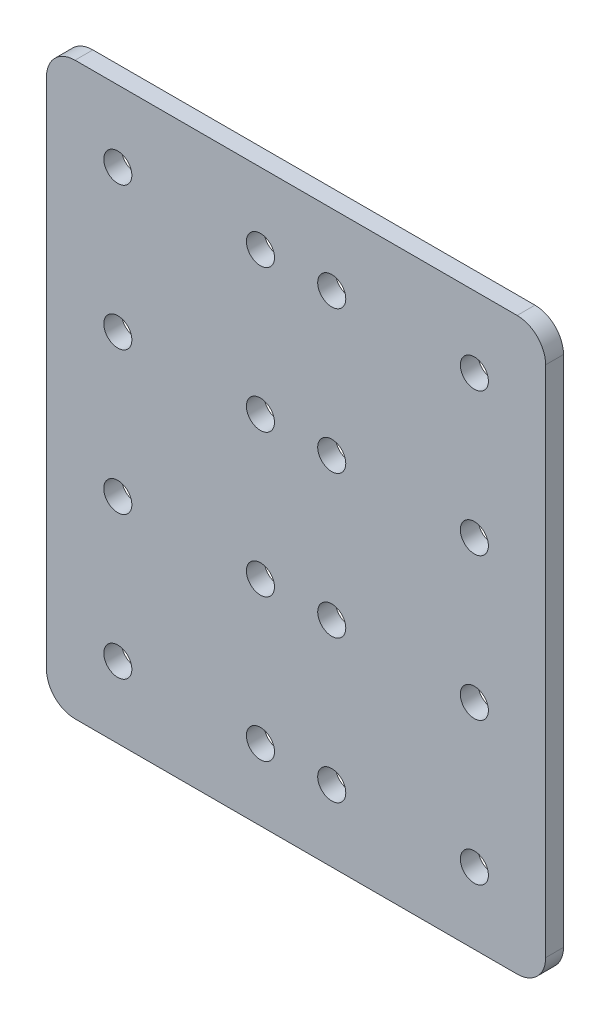
ISO-10303-21;
HEADER;
FILE_DESCRIPTION(('STEP AP214'),'2;1');
FILE_NAME('part.step','',(''),(''),'','','');
FILE_SCHEMA(('AUTOMOTIVE_DESIGN { 1 0 10303 214 1 1 1 1 }'));
ENDSEC;
DATA;
#1=APPLICATION_CONTEXT('core data for automotive mechanical design processes');
#2=APPLICATION_PROTOCOL_DEFINITION('international standard','automotive_design',2000,#1);
#3=PRODUCT_CONTEXT('',#1,'mechanical');
#4=PRODUCT('Part','Part','',(#3));
#5=PRODUCT_RELATED_PRODUCT_CATEGORY('part','',(#4));
#6=PRODUCT_DEFINITION_FORMATION('','',#4);
#7=PRODUCT_DEFINITION_CONTEXT('part definition',#1,'design');
#8=PRODUCT_DEFINITION('design','',#6,#7);
#9=PRODUCT_DEFINITION_SHAPE('','',#8);
#10=(LENGTH_UNIT() NAMED_UNIT(*) SI_UNIT(.MILLI.,.METRE.));
#11=(NAMED_UNIT(*) PLANE_ANGLE_UNIT() SI_UNIT($,.RADIAN.));
#12=(NAMED_UNIT(*) SI_UNIT($,.STERADIAN.) SOLID_ANGLE_UNIT());
#13=UNCERTAINTY_MEASURE_WITH_UNIT(LENGTH_MEASURE(1.E-05),#10,'distance_accuracy_value','');
#14=(GEOMETRIC_REPRESENTATION_CONTEXT(3) GLOBAL_UNCERTAINTY_ASSIGNED_CONTEXT((#13)) GLOBAL_UNIT_ASSIGNED_CONTEXT((#10,
#11,#12)) REPRESENTATION_CONTEXT('',''));
#15=CARTESIAN_POINT('',(0.,0.,0.));
#16=DIRECTION('',(0.,0.,1.));
#17=DIRECTION('',(1.,0.,0.));
#18=AXIS2_PLACEMENT_3D('',#15,#16,#17);
#19=CARTESIAN_POINT('',(1176.02,20.32,3.175));
#20=DIRECTION('',(0.,0.,-1.));
#21=DIRECTION('',(-1.,0.,0.));
#22=AXIS2_PLACEMENT_3D('',#19,#20,#21);
#23=PLANE('',#22);
#24=CARTESIAN_POINT('',(1176.02,20.32,3.175));
#25=DIRECTION('',(0.,0.,1.));
#26=DIRECTION('',(-1.,0.,0.));
#27=AXIS2_PLACEMENT_3D('',#24,#25,#26);
#28=CIRCLE('',#27,5.07999999999999);
#29=CARTESIAN_POINT('',(1181.1,20.32,3.175));
#30=VERTEX_POINT('',#29);
#31=CARTESIAN_POINT('',(1176.02,25.4,3.175));
#32=VERTEX_POINT('',#31);
#33=EDGE_CURVE('E145',#30,#32,#28,.T.);
#34=ORIENTED_EDGE('',*,*,#33,.T.);
#35=DIRECTION('',(-1.,0.,0.));
#36=VECTOR('',#35,1.);
#37=CARTESIAN_POINT('',(1176.02,25.4,3.175));
#38=LINE('',#37,#36);
#39=CARTESIAN_POINT('',(1097.28,25.4,3.175));
#40=VERTEX_POINT('',#39);
#41=EDGE_CURVE('E93',#32,#40,#38,.T.);
#42=ORIENTED_EDGE('',*,*,#41,.T.);
#43=CARTESIAN_POINT('',(1097.28,20.32,3.175));
#44=DIRECTION('',(0.,0.,1.));
#45=DIRECTION('',(1.,0.,0.));
#46=AXIS2_PLACEMENT_3D('',#43,#44,#45);
#47=CIRCLE('',#46,5.07999999999999);
#48=CARTESIAN_POINT('',(1092.2,20.32,3.175));
#49=VERTEX_POINT('',#48);
#50=EDGE_CURVE('E160',#40,#49,#47,.T.);
#51=ORIENTED_EDGE('',*,*,#50,.T.);
#52=DIRECTION('',(0.,-1.,0.));
#53=VECTOR('',#52,1.);
#54=CARTESIAN_POINT('',(1092.2,20.32,3.175));
#55=LINE('',#54,#53);
#56=CARTESIAN_POINT('',(1092.2,-71.1199999999999,3.175));
#57=VERTEX_POINT('',#56);
#58=EDGE_CURVE('E173',#49,#57,#55,.T.);
#59=ORIENTED_EDGE('',*,*,#58,.T.);
#60=CARTESIAN_POINT('',(1097.28,-71.1199999999999,3.175));
#61=DIRECTION('',(0.,0.,1.));
#62=DIRECTION('',(-1.,0.,0.));
#63=AXIS2_PLACEMENT_3D('',#60,#61,#62);
#64=CIRCLE('',#63,5.07999999999998);
#65=CARTESIAN_POINT('',(1097.28,-76.1999999999999,3.175));
#66=VERTEX_POINT('',#65);
#67=EDGE_CURVE('E112',#57,#66,#64,.T.);
#68=ORIENTED_EDGE('',*,*,#67,.T.);
#69=DIRECTION('',(1.,0.,0.));
#70=VECTOR('',#69,1.);
#71=CARTESIAN_POINT('',(1176.02,-76.2,3.175));
#72=LINE('',#71,#70);
#73=CARTESIAN_POINT('',(1176.02,-76.2,3.175));
#74=VERTEX_POINT('',#73);
#75=EDGE_CURVE('E106',#66,#74,#72,.T.);
#76=ORIENTED_EDGE('',*,*,#75,.T.);
#77=CARTESIAN_POINT('',(1176.02,-71.12,3.175));
#78=DIRECTION('',(0.,0.,1.));
#79=DIRECTION('',(-1.,0.,0.));
#80=AXIS2_PLACEMENT_3D('',#77,#78,#79);
#81=CIRCLE('',#80,5.07999999999999);
#82=CARTESIAN_POINT('',(1181.1,-71.1199999999999,3.175));
#83=VERTEX_POINT('',#82);
#84=EDGE_CURVE('E110',#74,#83,#81,.T.);
#85=ORIENTED_EDGE('',*,*,#84,.T.);
#86=DIRECTION('',(0.,1.,0.));
#87=VECTOR('',#86,1.);
#88=CARTESIAN_POINT('',(1181.1,20.32,3.175));
#89=LINE('',#88,#87);
#90=EDGE_CURVE('E50',#83,#30,#89,.T.);
#91=ORIENTED_EDGE('',*,*,#90,.T.);
#92=EDGE_LOOP('',(#34,#42,#51,#59,#68,#76,#85,#91));
#93=FACE_BOUND('',#92,.T.);
#94=CARTESIAN_POINT('',(1143.,12.7,3.175));
#95=DIRECTION('',(0.,0.,1.));
#96=DIRECTION('',(1.,0.,0.));
#97=AXIS2_PLACEMENT_3D('',#94,#95,#96);
#98=CIRCLE('',#97,2.49999999999969);
#99=CARTESIAN_POINT('',(1145.5,12.7,3.175));
#100=VERTEX_POINT('',#99);
#101=EDGE_CURVE('E134',#100,#100,#98,.T.);
#102=ORIENTED_EDGE('',*,*,#101,.F.);
#103=EDGE_LOOP('',(#102));
#104=FACE_BOUND('',#103,.T.);
#105=CARTESIAN_POINT('',(1168.4,12.7000000000004,3.175));
#106=DIRECTION('',(0.,0.,1.));
#107=DIRECTION('',(1.,0.,0.));
#108=AXIS2_PLACEMENT_3D('',#105,#106,#107);
#109=CIRCLE('',#108,2.49999999999969);
#110=CARTESIAN_POINT('',(1170.9,12.7000000000004,3.175));
#111=VERTEX_POINT('',#110);
#112=EDGE_CURVE('E182',#111,#111,#109,.T.);
#113=ORIENTED_EDGE('',*,*,#112,.F.);
#114=EDGE_LOOP('',(#113));
#115=FACE_BOUND('',#114,.T.);
#116=CARTESIAN_POINT('',(1104.9,12.7000000000004,3.175));
#117=DIRECTION('',(0.,0.,1.));
#118=DIRECTION('',(-1.,0.,0.));
#119=AXIS2_PLACEMENT_3D('',#116,#117,#118);
#120=CIRCLE('',#119,2.49999999999969);
#121=CARTESIAN_POINT('',(1102.4,12.7000000000004,3.175));
#122=VERTEX_POINT('',#121);
#123=EDGE_CURVE('E188',#122,#122,#120,.T.);
#124=ORIENTED_EDGE('',*,*,#123,.F.);
#125=EDGE_LOOP('',(#124));
#126=FACE_BOUND('',#125,.T.);
#127=CARTESIAN_POINT('',(1168.4,-12.6999999999996,3.175));
#128=DIRECTION('',(0.,0.,1.));
#129=DIRECTION('',(1.,0.,0.));
#130=AXIS2_PLACEMENT_3D('',#127,#128,#129);
#131=CIRCLE('',#130,2.49999999999969);
#132=CARTESIAN_POINT('',(1170.9,-12.6999999999996,3.175));
#133=VERTEX_POINT('',#132);
#134=EDGE_CURVE('E194',#133,#133,#131,.T.);
#135=ORIENTED_EDGE('',*,*,#134,.F.);
#136=EDGE_LOOP('',(#135));
#137=FACE_BOUND('',#136,.T.);
#138=CARTESIAN_POINT('',(1104.9,-12.6999999999996,3.175));
#139=DIRECTION('',(0.,0.,1.));
#140=DIRECTION('',(-1.,0.,0.));
#141=AXIS2_PLACEMENT_3D('',#138,#139,#140);
#142=CIRCLE('',#141,2.49999999999969);
#143=CARTESIAN_POINT('',(1102.4,-12.6999999999996,3.175));
#144=VERTEX_POINT('',#143);
#145=EDGE_CURVE('E200',#144,#144,#142,.T.);
#146=ORIENTED_EDGE('',*,*,#145,.F.);
#147=EDGE_LOOP('',(#146));
#148=FACE_BOUND('',#147,.T.);
#149=CARTESIAN_POINT('',(1168.4,-38.0999999999996,3.175));
#150=DIRECTION('',(0.,0.,1.));
#151=DIRECTION('',(1.,0.,0.));
#152=AXIS2_PLACEMENT_3D('',#149,#150,#151);
#153=CIRCLE('',#152,2.49999999999969);
#154=CARTESIAN_POINT('',(1170.9,-38.0999999999996,3.175));
#155=VERTEX_POINT('',#154);
#156=EDGE_CURVE('E206',#155,#155,#153,.T.);
#157=ORIENTED_EDGE('',*,*,#156,.F.);
#158=EDGE_LOOP('',(#157));
#159=FACE_BOUND('',#158,.T.);
#160=CARTESIAN_POINT('',(1104.9,-38.0999999999996,3.175));
#161=DIRECTION('',(0.,0.,1.));
#162=DIRECTION('',(-1.,0.,0.));
#163=AXIS2_PLACEMENT_3D('',#160,#161,#162);
#164=CIRCLE('',#163,2.49999999999969);
#165=CARTESIAN_POINT('',(1102.4,-38.0999999999996,3.175));
#166=VERTEX_POINT('',#165);
#167=EDGE_CURVE('E212',#166,#166,#164,.T.);
#168=ORIENTED_EDGE('',*,*,#167,.F.);
#169=EDGE_LOOP('',(#168));
#170=FACE_BOUND('',#169,.T.);
#171=CARTESIAN_POINT('',(1168.4,-63.4999999999996,3.175));
#172=DIRECTION('',(0.,0.,1.));
#173=DIRECTION('',(1.,0.,0.));
#174=AXIS2_PLACEMENT_3D('',#171,#172,#173);
#175=CIRCLE('',#174,2.49999999999968);
#176=CARTESIAN_POINT('',(1170.9,-63.4999999999996,3.175));
#177=VERTEX_POINT('',#176);
#178=EDGE_CURVE('E218',#177,#177,#175,.T.);
#179=ORIENTED_EDGE('',*,*,#178,.F.);
#180=EDGE_LOOP('',(#179));
#181=FACE_BOUND('',#180,.T.);
#182=CARTESIAN_POINT('',(1104.9,-63.4999999999996,3.175));
#183=DIRECTION('',(0.,0.,1.));
#184=DIRECTION('',(-1.,0.,0.));
#185=AXIS2_PLACEMENT_3D('',#182,#183,#184);
#186=CIRCLE('',#185,2.49999999999968);
#187=CARTESIAN_POINT('',(1102.4,-63.4999999999996,3.175));
#188=VERTEX_POINT('',#187);
#189=EDGE_CURVE('E224',#188,#188,#186,.T.);
#190=ORIENTED_EDGE('',*,*,#189,.F.);
#191=EDGE_LOOP('',(#190));
#192=FACE_BOUND('',#191,.T.);
#193=CARTESIAN_POINT('',(1130.3,-63.5,3.175));
#194=DIRECTION('',(0.,0.,1.));
#195=DIRECTION('',(-1.,0.,0.));
#196=AXIS2_PLACEMENT_3D('',#193,#194,#195);
#197=CIRCLE('',#196,2.49999999999968);
#198=CARTESIAN_POINT('',(1127.8,-63.5,3.175));
#199=VERTEX_POINT('',#198);
#200=EDGE_CURVE('E230',#199,#199,#197,.T.);
#201=ORIENTED_EDGE('',*,*,#200,.F.);
#202=EDGE_LOOP('',(#201));
#203=FACE_BOUND('',#202,.T.);
#204=CARTESIAN_POINT('',(1130.3,-38.1,3.175));
#205=DIRECTION('',(0.,0.,1.));
#206=DIRECTION('',(-1.,0.,0.));
#207=AXIS2_PLACEMENT_3D('',#204,#205,#206);
#208=CIRCLE('',#207,2.49999999999969);
#209=CARTESIAN_POINT('',(1127.8,-38.1,3.175));
#210=VERTEX_POINT('',#209);
#211=EDGE_CURVE('E236',#210,#210,#208,.T.);
#212=ORIENTED_EDGE('',*,*,#211,.F.);
#213=EDGE_LOOP('',(#212));
#214=FACE_BOUND('',#213,.T.);
#215=CARTESIAN_POINT('',(1130.3,-12.7,3.175));
#216=DIRECTION('',(0.,0.,1.));
#217=DIRECTION('',(-1.,0.,0.));
#218=AXIS2_PLACEMENT_3D('',#215,#216,#217);
#219=CIRCLE('',#218,2.49999999999969);
#220=CARTESIAN_POINT('',(1127.8,-12.7,3.175));
#221=VERTEX_POINT('',#220);
#222=EDGE_CURVE('E242',#221,#221,#219,.T.);
#223=ORIENTED_EDGE('',*,*,#222,.F.);
#224=EDGE_LOOP('',(#223));
#225=FACE_BOUND('',#224,.T.);
#226=CARTESIAN_POINT('',(1130.3,12.7,3.175));
#227=DIRECTION('',(0.,0.,1.));
#228=DIRECTION('',(-1.,0.,0.));
#229=AXIS2_PLACEMENT_3D('',#226,#227,#228);
#230=CIRCLE('',#229,2.49999999999969);
#231=CARTESIAN_POINT('',(1127.8,12.7,3.175));
#232=VERTEX_POINT('',#231);
#233=EDGE_CURVE('E248',#232,#232,#230,.T.);
#234=ORIENTED_EDGE('',*,*,#233,.F.);
#235=EDGE_LOOP('',(#234));
#236=FACE_BOUND('',#235,.T.);
#237=CARTESIAN_POINT('',(1143.,-12.7,3.175));
#238=DIRECTION('',(0.,0.,1.));
#239=DIRECTION('',(1.,0.,0.));
#240=AXIS2_PLACEMENT_3D('',#237,#238,#239);
#241=CIRCLE('',#240,2.49999999999969);
#242=CARTESIAN_POINT('',(1145.5,-12.7,3.175));
#243=VERTEX_POINT('',#242);
#244=EDGE_CURVE('E254',#243,#243,#241,.T.);
#245=ORIENTED_EDGE('',*,*,#244,.F.);
#246=EDGE_LOOP('',(#245));
#247=FACE_BOUND('',#246,.T.);
#248=CARTESIAN_POINT('',(1143.,-38.1,3.175));
#249=DIRECTION('',(0.,0.,1.));
#250=DIRECTION('',(1.,0.,0.));
#251=AXIS2_PLACEMENT_3D('',#248,#249,#250);
#252=CIRCLE('',#251,2.49999999999969);
#253=CARTESIAN_POINT('',(1145.5,-38.1,3.175));
#254=VERTEX_POINT('',#253);
#255=EDGE_CURVE('E260',#254,#254,#252,.T.);
#256=ORIENTED_EDGE('',*,*,#255,.F.);
#257=EDGE_LOOP('',(#256));
#258=FACE_BOUND('',#257,.T.);
#259=CARTESIAN_POINT('',(1143.,-63.5,3.175));
#260=DIRECTION('',(0.,0.,1.));
#261=DIRECTION('',(1.,0.,0.));
#262=AXIS2_PLACEMENT_3D('',#259,#260,#261);
#263=CIRCLE('',#262,2.49999999999968);
#264=CARTESIAN_POINT('',(1145.5,-63.5,3.175));
#265=VERTEX_POINT('',#264);
#266=EDGE_CURVE('E266',#265,#265,#263,.T.);
#267=ORIENTED_EDGE('',*,*,#266,.F.);
#268=EDGE_LOOP('',(#267));
#269=FACE_BOUND('',#268,.T.);
#270=ADVANCED_FACE('F33',(#93,#104,#115,#126,#137,#148,#159,#170,#181,#192,#203,#214,#225,#236,
#247,#258,#269),#23,.F.);
#271=CARTESIAN_POINT('',(1176.02,20.32,0.));
#272=DIRECTION('',(0.,0.,-1.));
#273=DIRECTION('',(-1.,0.,0.));
#274=AXIS2_PLACEMENT_3D('',#271,#272,#273);
#275=PLANE('',#274);
#276=CARTESIAN_POINT('',(1143.,-38.1,0.));
#277=DIRECTION('',(0.,0.,1.));
#278=DIRECTION('',(1.,0.,0.));
#279=AXIS2_PLACEMENT_3D('',#276,#277,#278);
#280=CIRCLE('',#279,2.49999999999969);
#281=CARTESIAN_POINT('',(1145.5,-38.1,0.));
#282=VERTEX_POINT('',#281);
#283=EDGE_CURVE('E263',#282,#282,#280,.T.);
#284=ORIENTED_EDGE('',*,*,#283,.T.);
#285=EDGE_LOOP('',(#284));
#286=FACE_BOUND('',#285,.T.);
#287=CARTESIAN_POINT('',(1130.3,12.7,0.));
#288=DIRECTION('',(0.,0.,1.));
#289=DIRECTION('',(-1.,0.,0.));
#290=AXIS2_PLACEMENT_3D('',#287,#288,#289);
#291=CIRCLE('',#290,2.49999999999969);
#292=CARTESIAN_POINT('',(1127.8,12.7,0.));
#293=VERTEX_POINT('',#292);
#294=EDGE_CURVE('E251',#293,#293,#291,.T.);
#295=ORIENTED_EDGE('',*,*,#294,.T.);
#296=EDGE_LOOP('',(#295));
#297=FACE_BOUND('',#296,.T.);
#298=CARTESIAN_POINT('',(1130.3,-38.1,0.));
#299=DIRECTION('',(0.,0.,1.));
#300=DIRECTION('',(-1.,0.,0.));
#301=AXIS2_PLACEMENT_3D('',#298,#299,#300);
#302=CIRCLE('',#301,2.49999999999969);
#303=CARTESIAN_POINT('',(1127.8,-38.1,0.));
#304=VERTEX_POINT('',#303);
#305=EDGE_CURVE('E239',#304,#304,#302,.T.);
#306=ORIENTED_EDGE('',*,*,#305,.T.);
#307=EDGE_LOOP('',(#306));
#308=FACE_BOUND('',#307,.T.);
#309=CARTESIAN_POINT('',(1104.9,-63.4999999999996,0.));
#310=DIRECTION('',(0.,0.,1.));
#311=DIRECTION('',(-1.,0.,0.));
#312=AXIS2_PLACEMENT_3D('',#309,#310,#311);
#313=CIRCLE('',#312,2.49999999999968);
#314=CARTESIAN_POINT('',(1102.4,-63.4999999999996,0.));
#315=VERTEX_POINT('',#314);
#316=EDGE_CURVE('E227',#315,#315,#313,.T.);
#317=ORIENTED_EDGE('',*,*,#316,.T.);
#318=EDGE_LOOP('',(#317));
#319=FACE_BOUND('',#318,.T.);
#320=CARTESIAN_POINT('',(1104.9,-38.0999999999996,0.));
#321=DIRECTION('',(0.,0.,1.));
#322=DIRECTION('',(-1.,0.,0.));
#323=AXIS2_PLACEMENT_3D('',#320,#321,#322);
#324=CIRCLE('',#323,2.49999999999969);
#325=CARTESIAN_POINT('',(1102.4,-38.0999999999996,0.));
#326=VERTEX_POINT('',#325);
#327=EDGE_CURVE('E215',#326,#326,#324,.T.);
#328=ORIENTED_EDGE('',*,*,#327,.T.);
#329=EDGE_LOOP('',(#328));
#330=FACE_BOUND('',#329,.T.);
#331=CARTESIAN_POINT('',(1104.9,-12.6999999999996,0.));
#332=DIRECTION('',(0.,0.,1.));
#333=DIRECTION('',(-1.,0.,0.));
#334=AXIS2_PLACEMENT_3D('',#331,#332,#333);
#335=CIRCLE('',#334,2.49999999999969);
#336=CARTESIAN_POINT('',(1102.4,-12.6999999999996,0.));
#337=VERTEX_POINT('',#336);
#338=EDGE_CURVE('E203',#337,#337,#335,.T.);
#339=ORIENTED_EDGE('',*,*,#338,.T.);
#340=EDGE_LOOP('',(#339));
#341=FACE_BOUND('',#340,.T.);
#342=CARTESIAN_POINT('',(1104.9,12.7000000000004,0.));
#343=DIRECTION('',(0.,0.,1.));
#344=DIRECTION('',(-1.,0.,0.));
#345=AXIS2_PLACEMENT_3D('',#342,#343,#344);
#346=CIRCLE('',#345,2.49999999999969);
#347=CARTESIAN_POINT('',(1102.4,12.7000000000004,0.));
#348=VERTEX_POINT('',#347);
#349=EDGE_CURVE('E191',#348,#348,#346,.T.);
#350=ORIENTED_EDGE('',*,*,#349,.T.);
#351=EDGE_LOOP('',(#350));
#352=FACE_BOUND('',#351,.T.);
#353=CARTESIAN_POINT('',(1143.,12.7,0.));
#354=DIRECTION('',(0.,0.,1.));
#355=DIRECTION('',(1.,0.,0.));
#356=AXIS2_PLACEMENT_3D('',#353,#354,#355);
#357=CIRCLE('',#356,2.49999999999969);
#358=CARTESIAN_POINT('',(1145.5,12.7,0.));
#359=VERTEX_POINT('',#358);
#360=EDGE_CURVE('E179',#359,#359,#357,.T.);
#361=ORIENTED_EDGE('',*,*,#360,.T.);
#362=EDGE_LOOP('',(#361));
#363=FACE_BOUND('',#362,.T.);
#364=CARTESIAN_POINT('',(1176.02,20.32,0.));
#365=DIRECTION('',(0.,0.,1.));
#366=DIRECTION('',(-1.,0.,0.));
#367=AXIS2_PLACEMENT_3D('',#364,#365,#366);
#368=CIRCLE('',#367,5.07999999999999);
#369=CARTESIAN_POINT('',(1181.1,20.32,0.));
#370=VERTEX_POINT('',#369);
#371=CARTESIAN_POINT('',(1176.02,25.4,0.));
#372=VERTEX_POINT('',#371);
#373=EDGE_CURVE('E130',#370,#372,#368,.T.);
#374=ORIENTED_EDGE('',*,*,#373,.F.);
#375=DIRECTION('',(0.,1.,0.));
#376=VECTOR('',#375,1.);
#377=CARTESIAN_POINT('',(1181.1,20.32,0.));
#378=LINE('',#377,#376);
#379=CARTESIAN_POINT('',(1181.1,-71.1199999999999,0.));
#380=VERTEX_POINT('',#379);
#381=EDGE_CURVE('E85',#380,#370,#378,.T.);
#382=ORIENTED_EDGE('',*,*,#381,.F.);
#383=CARTESIAN_POINT('',(1176.02,-71.12,0.));
#384=DIRECTION('',(0.,0.,1.));
#385=DIRECTION('',(-1.,0.,0.));
#386=AXIS2_PLACEMENT_3D('',#383,#384,#385);
#387=CIRCLE('',#386,5.07999999999999);
#388=CARTESIAN_POINT('',(1176.02,-76.2,0.));
#389=VERTEX_POINT('',#388);
#390=EDGE_CURVE('E79',#389,#380,#387,.T.);
#391=ORIENTED_EDGE('',*,*,#390,.F.);
#392=DIRECTION('',(1.,0.,0.));
#393=VECTOR('',#392,1.);
#394=CARTESIAN_POINT('',(1176.02,-76.2,0.));
#395=LINE('',#394,#393);
#396=CARTESIAN_POINT('',(1097.28,-76.1999999999999,0.));
#397=VERTEX_POINT('',#396);
#398=EDGE_CURVE('E120',#397,#389,#395,.T.);
#399=ORIENTED_EDGE('',*,*,#398,.F.);
#400=CARTESIAN_POINT('',(1097.28,-71.1199999999999,0.));
#401=DIRECTION('',(0.,0.,1.));
#402=DIRECTION('',(-1.,0.,0.));
#403=AXIS2_PLACEMENT_3D('',#400,#401,#402);
#404=CIRCLE('',#403,5.07999999999998);
#405=CARTESIAN_POINT('',(1092.2,-71.1199999999999,0.));
#406=VERTEX_POINT('',#405);
#407=EDGE_CURVE('E140',#406,#397,#404,.T.);
#408=ORIENTED_EDGE('',*,*,#407,.F.);
#409=DIRECTION('',(0.,-1.,0.));
#410=VECTOR('',#409,1.);
#411=CARTESIAN_POINT('',(1092.2,20.32,0.));
#412=LINE('',#411,#410);
#413=CARTESIAN_POINT('',(1092.2,20.32,0.));
#414=VERTEX_POINT('',#413);
#415=EDGE_CURVE('E138',#414,#406,#412,.T.);
#416=ORIENTED_EDGE('',*,*,#415,.F.);
#417=CARTESIAN_POINT('',(1097.28,20.32,0.));
#418=DIRECTION('',(0.,0.,1.));
#419=DIRECTION('',(1.,0.,0.));
#420=AXIS2_PLACEMENT_3D('',#417,#418,#419);
#421=CIRCLE('',#420,5.07999999999999);
#422=CARTESIAN_POINT('',(1097.28,25.4,0.));
#423=VERTEX_POINT('',#422);
#424=EDGE_CURVE('E136',#423,#414,#421,.T.);
#425=ORIENTED_EDGE('',*,*,#424,.F.);
#426=DIRECTION('',(-1.,0.,0.));
#427=VECTOR('',#426,1.);
#428=CARTESIAN_POINT('',(1176.02,25.4,0.));
#429=LINE('',#428,#427);
#430=EDGE_CURVE('E133',#372,#423,#429,.T.);
#431=ORIENTED_EDGE('',*,*,#430,.F.);
#432=EDGE_LOOP('',(#374,#382,#391,#399,#408,#416,#425,#431));
#433=FACE_BOUND('',#432,.T.);
#434=CARTESIAN_POINT('',(1168.4,12.7000000000004,0.));
#435=DIRECTION('',(0.,0.,1.));
#436=DIRECTION('',(1.,0.,0.));
#437=AXIS2_PLACEMENT_3D('',#434,#435,#436);
#438=CIRCLE('',#437,2.49999999999969);
#439=CARTESIAN_POINT('',(1170.9,12.7000000000004,0.));
#440=VERTEX_POINT('',#439);
#441=EDGE_CURVE('E185',#440,#440,#438,.T.);
#442=ORIENTED_EDGE('',*,*,#441,.T.);
#443=EDGE_LOOP('',(#442));
#444=FACE_BOUND('',#443,.T.);
#445=CARTESIAN_POINT('',(1168.4,-12.6999999999996,0.));
#446=DIRECTION('',(0.,0.,1.));
#447=DIRECTION('',(1.,0.,0.));
#448=AXIS2_PLACEMENT_3D('',#445,#446,#447);
#449=CIRCLE('',#448,2.49999999999969);
#450=CARTESIAN_POINT('',(1170.9,-12.6999999999996,0.));
#451=VERTEX_POINT('',#450);
#452=EDGE_CURVE('E197',#451,#451,#449,.T.);
#453=ORIENTED_EDGE('',*,*,#452,.T.);
#454=EDGE_LOOP('',(#453));
#455=FACE_BOUND('',#454,.T.);
#456=CARTESIAN_POINT('',(1168.4,-38.0999999999996,0.));
#457=DIRECTION('',(0.,0.,1.));
#458=DIRECTION('',(1.,0.,0.));
#459=AXIS2_PLACEMENT_3D('',#456,#457,#458);
#460=CIRCLE('',#459,2.49999999999969);
#461=CARTESIAN_POINT('',(1170.9,-38.0999999999996,0.));
#462=VERTEX_POINT('',#461);
#463=EDGE_CURVE('E209',#462,#462,#460,.T.);
#464=ORIENTED_EDGE('',*,*,#463,.T.);
#465=EDGE_LOOP('',(#464));
#466=FACE_BOUND('',#465,.T.);
#467=CARTESIAN_POINT('',(1168.4,-63.4999999999996,0.));
#468=DIRECTION('',(0.,0.,1.));
#469=DIRECTION('',(1.,0.,0.));
#470=AXIS2_PLACEMENT_3D('',#467,#468,#469);
#471=CIRCLE('',#470,2.49999999999968);
#472=CARTESIAN_POINT('',(1170.9,-63.4999999999996,0.));
#473=VERTEX_POINT('',#472);
#474=EDGE_CURVE('E221',#473,#473,#471,.T.);
#475=ORIENTED_EDGE('',*,*,#474,.T.);
#476=EDGE_LOOP('',(#475));
#477=FACE_BOUND('',#476,.T.);
#478=CARTESIAN_POINT('',(1130.3,-63.5,0.));
#479=DIRECTION('',(0.,0.,1.));
#480=DIRECTION('',(-1.,0.,0.));
#481=AXIS2_PLACEMENT_3D('',#478,#479,#480);
#482=CIRCLE('',#481,2.49999999999968);
#483=CARTESIAN_POINT('',(1127.8,-63.5,0.));
#484=VERTEX_POINT('',#483);
#485=EDGE_CURVE('E233',#484,#484,#482,.T.);
#486=ORIENTED_EDGE('',*,*,#485,.T.);
#487=EDGE_LOOP('',(#486));
#488=FACE_BOUND('',#487,.T.);
#489=CARTESIAN_POINT('',(1130.3,-12.7,0.));
#490=DIRECTION('',(0.,0.,1.));
#491=DIRECTION('',(-1.,0.,0.));
#492=AXIS2_PLACEMENT_3D('',#489,#490,#491);
#493=CIRCLE('',#492,2.49999999999969);
#494=CARTESIAN_POINT('',(1127.8,-12.7,0.));
#495=VERTEX_POINT('',#494);
#496=EDGE_CURVE('E245',#495,#495,#493,.T.);
#497=ORIENTED_EDGE('',*,*,#496,.T.);
#498=EDGE_LOOP('',(#497));
#499=FACE_BOUND('',#498,.T.);
#500=CARTESIAN_POINT('',(1143.,-12.7,0.));
#501=DIRECTION('',(0.,0.,1.));
#502=DIRECTION('',(1.,0.,0.));
#503=AXIS2_PLACEMENT_3D('',#500,#501,#502);
#504=CIRCLE('',#503,2.49999999999969);
#505=CARTESIAN_POINT('',(1145.5,-12.7,0.));
#506=VERTEX_POINT('',#505);
#507=EDGE_CURVE('E257',#506,#506,#504,.T.);
#508=ORIENTED_EDGE('',*,*,#507,.T.);
#509=EDGE_LOOP('',(#508));
#510=FACE_BOUND('',#509,.T.);
#511=CARTESIAN_POINT('',(1143.,-63.5,0.));
#512=DIRECTION('',(0.,0.,1.));
#513=DIRECTION('',(1.,0.,0.));
#514=AXIS2_PLACEMENT_3D('',#511,#512,#513);
#515=CIRCLE('',#514,2.49999999999968);
#516=CARTESIAN_POINT('',(1145.5,-63.5,0.));
#517=VERTEX_POINT('',#516);
#518=EDGE_CURVE('E269',#517,#517,#515,.T.);
#519=ORIENTED_EDGE('',*,*,#518,.T.);
#520=EDGE_LOOP('',(#519));
#521=FACE_BOUND('',#520,.T.);
#522=ADVANCED_FACE('F164',(#286,#297,#308,#319,#330,#341,#352,#363,#433,#444,#455,#466,#477,
#488,#499,#510,#521),#275,.T.);
#523=CARTESIAN_POINT('',(1176.02,20.32,3.175));
#524=DIRECTION('',(0.,0.,-1.));
#525=DIRECTION('',(-1.,0.,0.));
#526=AXIS2_PLACEMENT_3D('',#523,#524,#525);
#527=CYLINDRICAL_SURFACE('',#526,5.07999999999999);
#528=ORIENTED_EDGE('',*,*,#373,.T.);
#529=DIRECTION('',(0.,0.,-1.));
#530=VECTOR('',#529,1.);
#531=CARTESIAN_POINT('',(1176.02,25.4,3.175));
#532=LINE('',#531,#530);
#533=EDGE_CURVE('E11',#32,#372,#532,.T.);
#534=ORIENTED_EDGE('',*,*,#533,.F.);
#535=ORIENTED_EDGE('',*,*,#33,.F.);
#536=DIRECTION('',(0.,0.,-1.));
#537=VECTOR('',#536,1.);
#538=CARTESIAN_POINT('',(1181.1,20.32,3.175));
#539=LINE('',#538,#537);
#540=EDGE_CURVE('E126',#30,#370,#539,.T.);
#541=ORIENTED_EDGE('',*,*,#540,.T.);
#542=EDGE_LOOP('',(#528,#534,#535,#541));
#543=FACE_BOUND('',#542,.T.);
#544=ADVANCED_FACE('F35',(#543),#527,.T.);
#545=CARTESIAN_POINT('',(1176.02,25.4,3.175));
#546=DIRECTION('',(0.,-1.,0.));
#547=DIRECTION('',(1.,0.,0.));
#548=AXIS2_PLACEMENT_3D('',#545,#546,#547);
#549=PLANE('',#548);
#550=ORIENTED_EDGE('',*,*,#430,.T.);
#551=DIRECTION('',(0.,0.,-1.));
#552=VECTOR('',#551,1.);
#553=CARTESIAN_POINT('',(1097.28,25.4,3.175));
#554=LINE('',#553,#552);
#555=EDGE_CURVE('E42',#40,#423,#554,.T.);
#556=ORIENTED_EDGE('',*,*,#555,.F.);
#557=ORIENTED_EDGE('',*,*,#41,.F.);
#558=ORIENTED_EDGE('',*,*,#533,.T.);
#559=EDGE_LOOP('',(#550,#556,#557,#558));
#560=FACE_BOUND('',#559,.T.);
#561=ADVANCED_FACE('F301',(#560),#549,.F.);
#562=CARTESIAN_POINT('',(1097.28,20.32,3.175));
#563=DIRECTION('',(0.,0.,-1.));
#564=DIRECTION('',(-1.,0.,0.));
#565=AXIS2_PLACEMENT_3D('',#562,#563,#564);
#566=CYLINDRICAL_SURFACE('',#565,5.07999999999999);
#567=ORIENTED_EDGE('',*,*,#424,.T.);
#568=DIRECTION('',(0.,0.,-1.));
#569=VECTOR('',#568,1.);
#570=CARTESIAN_POINT('',(1092.2,20.32,3.175));
#571=LINE('',#570,#569);
#572=EDGE_CURVE('E152',#49,#414,#571,.T.);
#573=ORIENTED_EDGE('',*,*,#572,.F.);
#574=ORIENTED_EDGE('',*,*,#50,.F.);
#575=ORIENTED_EDGE('',*,*,#555,.T.);
#576=EDGE_LOOP('',(#567,#573,#574,#575));
#577=FACE_BOUND('',#576,.T.);
#578=ADVANCED_FACE('F158',(#577),#566,.T.);
#579=CARTESIAN_POINT('',(1092.2,20.32,3.175));
#580=DIRECTION('',(1.,0.,0.));
#581=DIRECTION('',(0.,0.,-1.));
#582=AXIS2_PLACEMENT_3D('',#579,#580,#581);
#583=PLANE('',#582);
#584=ORIENTED_EDGE('',*,*,#415,.T.);
#585=DIRECTION('',(0.,0.,-1.));
#586=VECTOR('',#585,1.);
#587=CARTESIAN_POINT('',(1092.2,-71.1199999999999,3.175));
#588=LINE('',#587,#586);
#589=EDGE_CURVE('E149',#57,#406,#588,.T.);
#590=ORIENTED_EDGE('',*,*,#589,.F.);
#591=ORIENTED_EDGE('',*,*,#58,.F.);
#592=ORIENTED_EDGE('',*,*,#572,.T.);
#593=EDGE_LOOP('',(#584,#590,#591,#592));
#594=FACE_BOUND('',#593,.T.);
#595=ADVANCED_FACE('F169',(#594),#583,.F.);
#596=CARTESIAN_POINT('',(1097.28,-71.1199999999999,3.175));
#597=DIRECTION('',(0.,0.,-1.));
#598=DIRECTION('',(-1.,0.,0.));
#599=AXIS2_PLACEMENT_3D('',#596,#597,#598);
#600=CYLINDRICAL_SURFACE('',#599,5.07999999999998);
#601=ORIENTED_EDGE('',*,*,#407,.T.);
#602=DIRECTION('',(0.,0.,-1.));
#603=VECTOR('',#602,1.);
#604=CARTESIAN_POINT('',(1097.28,-76.1999999999999,3.175));
#605=LINE('',#604,#603);
#606=EDGE_CURVE('E121',#66,#397,#605,.T.);
#607=ORIENTED_EDGE('',*,*,#606,.F.);
#608=ORIENTED_EDGE('',*,*,#67,.F.);
#609=ORIENTED_EDGE('',*,*,#589,.T.);
#610=EDGE_LOOP('',(#601,#607,#608,#609));
#611=FACE_BOUND('',#610,.T.);
#612=ADVANCED_FACE('F172',(#611),#600,.T.);
#613=CARTESIAN_POINT('',(1176.02,-76.2,3.175));
#614=DIRECTION('',(0.,1.,0.));
#615=DIRECTION('',(-1.,0.,0.));
#616=AXIS2_PLACEMENT_3D('',#613,#614,#615);
#617=PLANE('',#616);
#618=ORIENTED_EDGE('',*,*,#398,.T.);
#619=DIRECTION('',(0.,0.,-1.));
#620=VECTOR('',#619,1.);
#621=CARTESIAN_POINT('',(1176.02,-76.2,3.175));
#622=LINE('',#621,#620);
#623=EDGE_CURVE('E117',#74,#389,#622,.T.);
#624=ORIENTED_EDGE('',*,*,#623,.F.);
#625=ORIENTED_EDGE('',*,*,#75,.F.);
#626=ORIENTED_EDGE('',*,*,#606,.T.);
#627=EDGE_LOOP('',(#618,#624,#625,#626));
#628=FACE_BOUND('',#627,.T.);
#629=ADVANCED_FACE('F118',(#628),#617,.F.);
#630=CARTESIAN_POINT('',(1176.02,-71.12,3.175));
#631=DIRECTION('',(0.,0.,-1.));
#632=DIRECTION('',(-1.,0.,0.));
#633=AXIS2_PLACEMENT_3D('',#630,#631,#632);
#634=CYLINDRICAL_SURFACE('',#633,5.07999999999999);
#635=ORIENTED_EDGE('',*,*,#390,.T.);
#636=DIRECTION('',(0.,0.,-1.));
#637=VECTOR('',#636,1.);
#638=CARTESIAN_POINT('',(1181.1,-71.1199999999999,3.175));
#639=LINE('',#638,#637);
#640=EDGE_CURVE('E122',#83,#380,#639,.T.);
#641=ORIENTED_EDGE('',*,*,#640,.F.);
#642=ORIENTED_EDGE('',*,*,#84,.F.);
#643=ORIENTED_EDGE('',*,*,#623,.T.);
#644=EDGE_LOOP('',(#635,#641,#642,#643));
#645=FACE_BOUND('',#644,.T.);
#646=ADVANCED_FACE('F124',(#645),#634,.T.);
#647=CARTESIAN_POINT('',(1181.1,20.32,3.175));
#648=DIRECTION('',(-1.,0.,0.));
#649=DIRECTION('',(0.,0.,1.));
#650=AXIS2_PLACEMENT_3D('',#647,#648,#649);
#651=PLANE('',#650);
#652=ORIENTED_EDGE('',*,*,#381,.T.);
#653=ORIENTED_EDGE('',*,*,#540,.F.);
#654=ORIENTED_EDGE('',*,*,#90,.F.);
#655=ORIENTED_EDGE('',*,*,#640,.T.);
#656=EDGE_LOOP('',(#652,#653,#654,#655));
#657=FACE_BOUND('',#656,.T.);
#658=ADVANCED_FACE('F289',(#657),#651,.F.);
#659=CARTESIAN_POINT('',(1143.,12.7,3.175));
#660=DIRECTION('',(0.,0.,-1.));
#661=DIRECTION('',(-1.,0.,0.));
#662=AXIS2_PLACEMENT_3D('',#659,#660,#661);
#663=CYLINDRICAL_SURFACE('',#662,2.49999999999969);
#664=ORIENTED_EDGE('',*,*,#101,.T.);
#665=EDGE_LOOP('',(#664));
#666=FACE_BOUND('',#665,.T.);
#667=ORIENTED_EDGE('',*,*,#360,.F.);
#668=EDGE_LOOP('',(#667));
#669=FACE_BOUND('',#668,.T.);
#670=ADVANCED_FACE('F286',(#666,#669),#663,.F.);
#671=CARTESIAN_POINT('',(1168.4,12.7000000000004,3.175));
#672=DIRECTION('',(0.,0.,-1.));
#673=DIRECTION('',(-1.,0.,0.));
#674=AXIS2_PLACEMENT_3D('',#671,#672,#673);
#675=CYLINDRICAL_SURFACE('',#674,2.49999999999969);
#676=ORIENTED_EDGE('',*,*,#112,.T.);
#677=EDGE_LOOP('',(#676));
#678=FACE_BOUND('',#677,.T.);
#679=ORIENTED_EDGE('',*,*,#441,.F.);
#680=EDGE_LOOP('',(#679));
#681=FACE_BOUND('',#680,.T.);
#682=ADVANCED_FACE('F365',(#678,#681),#675,.F.);
#683=CARTESIAN_POINT('',(1104.9,12.7000000000004,3.175));
#684=DIRECTION('',(0.,0.,-1.));
#685=DIRECTION('',(-1.,0.,0.));
#686=AXIS2_PLACEMENT_3D('',#683,#684,#685);
#687=CYLINDRICAL_SURFACE('',#686,2.49999999999969);
#688=ORIENTED_EDGE('',*,*,#123,.T.);
#689=EDGE_LOOP('',(#688));
#690=FACE_BOUND('',#689,.T.);
#691=ORIENTED_EDGE('',*,*,#349,.F.);
#692=EDGE_LOOP('',(#691));
#693=FACE_BOUND('',#692,.T.);
#694=ADVANCED_FACE('F373',(#690,#693),#687,.F.);
#695=CARTESIAN_POINT('',(1168.4,-12.6999999999996,3.175));
#696=DIRECTION('',(0.,0.,-1.));
#697=DIRECTION('',(-1.,0.,0.));
#698=AXIS2_PLACEMENT_3D('',#695,#696,#697);
#699=CYLINDRICAL_SURFACE('',#698,2.49999999999969);
#700=ORIENTED_EDGE('',*,*,#134,.T.);
#701=EDGE_LOOP('',(#700));
#702=FACE_BOUND('',#701,.T.);
#703=ORIENTED_EDGE('',*,*,#452,.F.);
#704=EDGE_LOOP('',(#703));
#705=FACE_BOUND('',#704,.T.);
#706=ADVANCED_FACE('F381',(#702,#705),#699,.F.);
#707=CARTESIAN_POINT('',(1104.9,-12.6999999999996,3.175));
#708=DIRECTION('',(0.,0.,-1.));
#709=DIRECTION('',(-1.,0.,0.));
#710=AXIS2_PLACEMENT_3D('',#707,#708,#709);
#711=CYLINDRICAL_SURFACE('',#710,2.49999999999969);
#712=ORIENTED_EDGE('',*,*,#145,.T.);
#713=EDGE_LOOP('',(#712));
#714=FACE_BOUND('',#713,.T.);
#715=ORIENTED_EDGE('',*,*,#338,.F.);
#716=EDGE_LOOP('',(#715));
#717=FACE_BOUND('',#716,.T.);
#718=ADVANCED_FACE('F390',(#714,#717),#711,.F.);
#719=CARTESIAN_POINT('',(1168.4,-38.0999999999996,3.175));
#720=DIRECTION('',(0.,0.,-1.));
#721=DIRECTION('',(-1.,0.,0.));
#722=AXIS2_PLACEMENT_3D('',#719,#720,#721);
#723=CYLINDRICAL_SURFACE('',#722,2.49999999999969);
#724=ORIENTED_EDGE('',*,*,#156,.T.);
#725=EDGE_LOOP('',(#724));
#726=FACE_BOUND('',#725,.T.);
#727=ORIENTED_EDGE('',*,*,#463,.F.);
#728=EDGE_LOOP('',(#727));
#729=FACE_BOUND('',#728,.T.);
#730=ADVANCED_FACE('F399',(#726,#729),#723,.F.);
#731=CARTESIAN_POINT('',(1104.9,-38.0999999999996,3.175));
#732=DIRECTION('',(0.,0.,-1.));
#733=DIRECTION('',(-1.,0.,0.));
#734=AXIS2_PLACEMENT_3D('',#731,#732,#733);
#735=CYLINDRICAL_SURFACE('',#734,2.49999999999969);
#736=ORIENTED_EDGE('',*,*,#167,.T.);
#737=EDGE_LOOP('',(#736));
#738=FACE_BOUND('',#737,.T.);
#739=ORIENTED_EDGE('',*,*,#327,.F.);
#740=EDGE_LOOP('',(#739));
#741=FACE_BOUND('',#740,.T.);
#742=ADVANCED_FACE('F408',(#738,#741),#735,.F.);
#743=CARTESIAN_POINT('',(1168.4,-63.4999999999996,3.175));
#744=DIRECTION('',(0.,0.,-1.));
#745=DIRECTION('',(-1.,0.,0.));
#746=AXIS2_PLACEMENT_3D('',#743,#744,#745);
#747=CYLINDRICAL_SURFACE('',#746,2.49999999999968);
#748=ORIENTED_EDGE('',*,*,#178,.T.);
#749=EDGE_LOOP('',(#748));
#750=FACE_BOUND('',#749,.T.);
#751=ORIENTED_EDGE('',*,*,#474,.F.);
#752=EDGE_LOOP('',(#751));
#753=FACE_BOUND('',#752,.T.);
#754=ADVANCED_FACE('F417',(#750,#753),#747,.F.);
#755=CARTESIAN_POINT('',(1104.9,-63.4999999999996,3.175));
#756=DIRECTION('',(0.,0.,-1.));
#757=DIRECTION('',(-1.,0.,0.));
#758=AXIS2_PLACEMENT_3D('',#755,#756,#757);
#759=CYLINDRICAL_SURFACE('',#758,2.49999999999968);
#760=ORIENTED_EDGE('',*,*,#189,.T.);
#761=EDGE_LOOP('',(#760));
#762=FACE_BOUND('',#761,.T.);
#763=ORIENTED_EDGE('',*,*,#316,.F.);
#764=EDGE_LOOP('',(#763));
#765=FACE_BOUND('',#764,.T.);
#766=ADVANCED_FACE('F426',(#762,#765),#759,.F.);
#767=CARTESIAN_POINT('',(1130.3,-63.5,3.175));
#768=DIRECTION('',(0.,0.,-1.));
#769=DIRECTION('',(-1.,0.,0.));
#770=AXIS2_PLACEMENT_3D('',#767,#768,#769);
#771=CYLINDRICAL_SURFACE('',#770,2.49999999999968);
#772=ORIENTED_EDGE('',*,*,#200,.T.);
#773=EDGE_LOOP('',(#772));
#774=FACE_BOUND('',#773,.T.);
#775=ORIENTED_EDGE('',*,*,#485,.F.);
#776=EDGE_LOOP('',(#775));
#777=FACE_BOUND('',#776,.T.);
#778=ADVANCED_FACE('F435',(#774,#777),#771,.F.);
#779=CARTESIAN_POINT('',(1130.3,-38.1,3.175));
#780=DIRECTION('',(0.,0.,-1.));
#781=DIRECTION('',(-1.,0.,0.));
#782=AXIS2_PLACEMENT_3D('',#779,#780,#781);
#783=CYLINDRICAL_SURFACE('',#782,2.49999999999969);
#784=ORIENTED_EDGE('',*,*,#211,.T.);
#785=EDGE_LOOP('',(#784));
#786=FACE_BOUND('',#785,.T.);
#787=ORIENTED_EDGE('',*,*,#305,.F.);
#788=EDGE_LOOP('',(#787));
#789=FACE_BOUND('',#788,.T.);
#790=ADVANCED_FACE('F444',(#786,#789),#783,.F.);
#791=CARTESIAN_POINT('',(1130.3,-12.7,3.175));
#792=DIRECTION('',(0.,0.,-1.));
#793=DIRECTION('',(-1.,0.,0.));
#794=AXIS2_PLACEMENT_3D('',#791,#792,#793);
#795=CYLINDRICAL_SURFACE('',#794,2.49999999999969);
#796=ORIENTED_EDGE('',*,*,#222,.T.);
#797=EDGE_LOOP('',(#796));
#798=FACE_BOUND('',#797,.T.);
#799=ORIENTED_EDGE('',*,*,#496,.F.);
#800=EDGE_LOOP('',(#799));
#801=FACE_BOUND('',#800,.T.);
#802=ADVANCED_FACE('F453',(#798,#801),#795,.F.);
#803=CARTESIAN_POINT('',(1130.3,12.7,3.175));
#804=DIRECTION('',(0.,0.,-1.));
#805=DIRECTION('',(-1.,0.,0.));
#806=AXIS2_PLACEMENT_3D('',#803,#804,#805);
#807=CYLINDRICAL_SURFACE('',#806,2.49999999999969);
#808=ORIENTED_EDGE('',*,*,#233,.T.);
#809=EDGE_LOOP('',(#808));
#810=FACE_BOUND('',#809,.T.);
#811=ORIENTED_EDGE('',*,*,#294,.F.);
#812=EDGE_LOOP('',(#811));
#813=FACE_BOUND('',#812,.T.);
#814=ADVANCED_FACE('F462',(#810,#813),#807,.F.);
#815=CARTESIAN_POINT('',(1143.,-12.7,3.175));
#816=DIRECTION('',(0.,0.,-1.));
#817=DIRECTION('',(-1.,0.,0.));
#818=AXIS2_PLACEMENT_3D('',#815,#816,#817);
#819=CYLINDRICAL_SURFACE('',#818,2.49999999999969);
#820=ORIENTED_EDGE('',*,*,#244,.T.);
#821=EDGE_LOOP('',(#820));
#822=FACE_BOUND('',#821,.T.);
#823=ORIENTED_EDGE('',*,*,#507,.F.);
#824=EDGE_LOOP('',(#823));
#825=FACE_BOUND('',#824,.T.);
#826=ADVANCED_FACE('F471',(#822,#825),#819,.F.);
#827=CARTESIAN_POINT('',(1143.,-38.1,3.175));
#828=DIRECTION('',(0.,0.,-1.));
#829=DIRECTION('',(-1.,0.,0.));
#830=AXIS2_PLACEMENT_3D('',#827,#828,#829);
#831=CYLINDRICAL_SURFACE('',#830,2.49999999999969);
#832=ORIENTED_EDGE('',*,*,#255,.T.);
#833=EDGE_LOOP('',(#832));
#834=FACE_BOUND('',#833,.T.);
#835=ORIENTED_EDGE('',*,*,#283,.F.);
#836=EDGE_LOOP('',(#835));
#837=FACE_BOUND('',#836,.T.);
#838=ADVANCED_FACE('F480',(#834,#837),#831,.F.);
#839=CARTESIAN_POINT('',(1143.,-63.5,3.175));
#840=DIRECTION('',(0.,0.,-1.));
#841=DIRECTION('',(-1.,0.,0.));
#842=AXIS2_PLACEMENT_3D('',#839,#840,#841);
#843=CYLINDRICAL_SURFACE('',#842,2.49999999999968);
#844=ORIENTED_EDGE('',*,*,#266,.T.);
#845=EDGE_LOOP('',(#844));
#846=FACE_BOUND('',#845,.T.);
#847=ORIENTED_EDGE('',*,*,#518,.F.);
#848=EDGE_LOOP('',(#847));
#849=FACE_BOUND('',#848,.T.);
#850=ADVANCED_FACE('F275',(#846,#849),#843,.F.);
#851=CLOSED_SHELL('',(#270,#522,#544,#561,#578,#595,#612,#629,#646,#658,#670,#682,#694,#706,
#718,#730,#742,#754,#766,#778,#790,#802,#814,#826,#838,#850));
#852=MANIFOLD_SOLID_BREP('B2',#851);
#853=ADVANCED_BREP_SHAPE_REPRESENTATION('',(#18,#852),#14);
#854=SHAPE_DEFINITION_REPRESENTATION(#9,#853);
ENDSEC;
END-ISO-10303-21;
